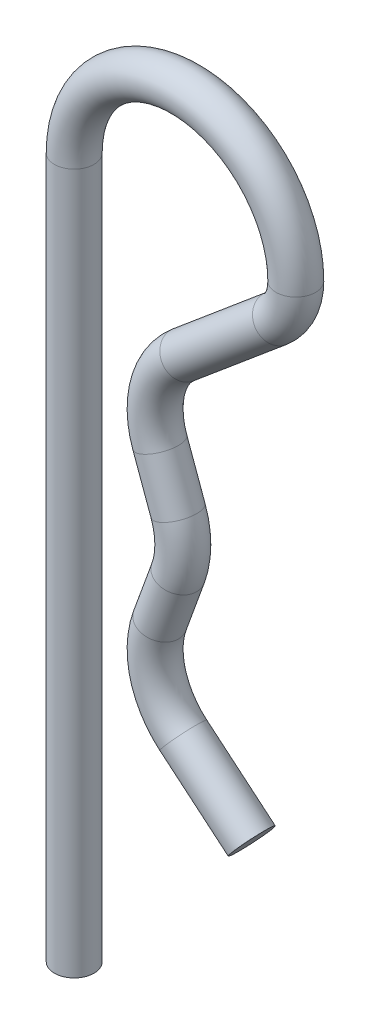
ISO-10303-21;
HEADER;
FILE_DESCRIPTION(('STEP AP214'),'2;1');
FILE_NAME('part.step','',(''),(''),'','','');
FILE_SCHEMA(('AUTOMOTIVE_DESIGN { 1 0 10303 214 1 1 1 1 }'));
ENDSEC;
DATA;
#1=APPLICATION_CONTEXT('core data for automotive mechanical design processes');
#2=APPLICATION_PROTOCOL_DEFINITION('international standard','automotive_design',2000,#1);
#3=PRODUCT_CONTEXT('',#1,'mechanical');
#4=PRODUCT('Part','Part','',(#3));
#5=PRODUCT_RELATED_PRODUCT_CATEGORY('part','',(#4));
#6=PRODUCT_DEFINITION_FORMATION('','',#4);
#7=PRODUCT_DEFINITION_CONTEXT('part definition',#1,'design');
#8=PRODUCT_DEFINITION('design','',#6,#7);
#9=PRODUCT_DEFINITION_SHAPE('','',#8);
#10=(LENGTH_UNIT() NAMED_UNIT(*) SI_UNIT(.MILLI.,.METRE.));
#11=(NAMED_UNIT(*) PLANE_ANGLE_UNIT() SI_UNIT($,.RADIAN.));
#12=(NAMED_UNIT(*) SI_UNIT($,.STERADIAN.) SOLID_ANGLE_UNIT());
#13=UNCERTAINTY_MEASURE_WITH_UNIT(LENGTH_MEASURE(1.E-05),#10,'distance_accuracy_value','');
#14=(GEOMETRIC_REPRESENTATION_CONTEXT(3) GLOBAL_UNCERTAINTY_ASSIGNED_CONTEXT((#13)) GLOBAL_UNIT_ASSIGNED_CONTEXT((#10,
#11,#12)) REPRESENTATION_CONTEXT('',''));
#15=CARTESIAN_POINT('',(0.,0.,0.));
#16=DIRECTION('',(0.,0.,1.));
#17=DIRECTION('',(1.,0.,0.));
#18=AXIS2_PLACEMENT_3D('',#15,#16,#17);
#19=CARTESIAN_POINT('',(22.4284719548847,-28.060779265165,0.));
#20=DIRECTION('',(-0.766044443118976,0.642787609686541,0.));
#21=DIRECTION('',(0.,0.,-1.));
#22=AXIS2_PLACEMENT_3D('',#19,#20,#21);
#23=PLANE('',#22);
#24=CARTESIAN_POINT('',(22.4284719548847,-28.060779265165,0.));
#25=DIRECTION('',(0.766044443118976,-0.642787609686541,0.));
#26=DIRECTION('',(0.,0.,-1.));
#27=AXIS2_PLACEMENT_3D('',#24,#25,#26);
#28=CIRCLE('',#27,2.5);
#29=CARTESIAN_POINT('',(22.4284719548847,-28.060779265165,-2.5));
#30=VERTEX_POINT('',#29);
#31=EDGE_CURVE('E48',#30,#30,#28,.T.);
#32=ORIENTED_EDGE('',*,*,#31,.T.);
#33=EDGE_LOOP('',(#32));
#34=FACE_BOUND('',#33,.T.);
#35=ADVANCED_FACE('F36',(#34),#23,.F.);
#36=CARTESIAN_POINT('',(0.,-52.5,0.));
#37=DIRECTION('',(0.,-1.,0.));
#38=DIRECTION('',(0.,0.,-1.));
#39=AXIS2_PLACEMENT_3D('',#36,#37,#38);
#40=PLANE('',#39);
#41=CARTESIAN_POINT('',(0.,-52.5,0.));
#42=DIRECTION('',(0.,1.,0.));
#43=DIRECTION('',(0.,0.,-1.));
#44=AXIS2_PLACEMENT_3D('',#41,#42,#43);
#45=CIRCLE('',#44,2.5);
#46=CARTESIAN_POINT('',(0.,-52.5,-2.5));
#47=VERTEX_POINT('',#46);
#48=EDGE_CURVE('E11',#47,#47,#45,.T.);
#49=ORIENTED_EDGE('',*,*,#48,.F.);
#50=EDGE_LOOP('',(#49));
#51=FACE_BOUND('',#50,.T.);
#52=ADVANCED_FACE('F54',(#51),#40,.T.);
#53=CARTESIAN_POINT('',(22.4284719548847,-28.060779265165,0.));
#54=DIRECTION('',(-0.766044443118976,0.642787609686541,0.));
#55=DIRECTION('',(-0.642787609686541,-0.766044443118977,0.));
#56=AXIS2_PLACEMENT_3D('',#53,#54,#55);
#57=CYLINDRICAL_SURFACE('',#56,2.5);
#58=CARTESIAN_POINT('',(13.7926345887832,-20.8144513163621,0.));
#59=DIRECTION('',(0.766044443118976,-0.642787609686541,0.));
#60=DIRECTION('',(0.,0.,-1.));
#61=AXIS2_PLACEMENT_3D('',#58,#59,#60);
#62=CIRCLE('',#61,2.5);
#63=CARTESIAN_POINT('',(12.1856655645668,-22.7295624241595,0.));
#64=VERTEX_POINT('',#63);
#65=EDGE_CURVE('E108',#64,#64,#62,.T.);
#66=ORIENTED_EDGE('',*,*,#65,.T.);
#67=EDGE_LOOP('',(#66));
#68=FACE_BOUND('',#67,.T.);
#69=ORIENTED_EDGE('',*,*,#31,.F.);
#70=EDGE_LOOP('',(#69));
#71=FACE_BOUND('',#70,.T.);
#72=ADVANCED_FACE('F56',(#68,#71),#57,.T.);
#73=CARTESIAN_POINT('',(20.2205106856486,-13.1540068851723,0.));
#74=DIRECTION('',(0.,0.,-1.));
#75=DIRECTION('',(-1.,0.,0.));
#76=AXIS2_PLACEMENT_3D('',#73,#74,#75);
#77=TOROIDAL_SURFACE('',#76,10.,2.5);
#78=CARTESIAN_POINT('',(10.8235844777895,-9.73380545191562,0.));
#79=DIRECTION('',(-0.342020143325666,-0.939692620785909,0.));
#80=DIRECTION('',(0.,0.,-1.));
#81=AXIS2_PLACEMENT_3D('',#78,#79,#80);
#82=CIRCLE('',#81,2.5);
#83=CARTESIAN_POINT('',(8.4743529258247,-8.87875509360146,0.));
#84=VERTEX_POINT('',#83);
#85=EDGE_CURVE('E105',#84,#84,#82,.T.);
#86=CARTESIAN_POINT('',(20.2205106856486,-13.1540068851723,0.));
#87=DIRECTION('',(0.,0.,-1.));
#88=DIRECTION('',(-1.,0.,0.));
#89=AXIS2_PLACEMENT_3D('',#86,#87,#88);
#90=CIRCLE('',#89,12.5);
#91=EDGE_CURVE('',#64,#84,#90,.T.);
#92=ORIENTED_EDGE('',*,*,#65,.F.);
#93=ORIENTED_EDGE('',*,*,#85,.T.);
#94=ORIENTED_EDGE('',*,*,#91,.T.);
#95=ORIENTED_EDGE('',*,*,#91,.F.);
#96=EDGE_LOOP('',(#92,#94,#93,#95));
#97=FACE_BOUND('',#96,.T.);
#98=ADVANCED_FACE('F61',(#97),#77,.T.);
#99=CARTESIAN_POINT('',(10.8235844777895,-9.73380545191562,0.));
#100=DIRECTION('',(0.342020143325666,0.939692620785909,0.));
#101=DIRECTION('',(-0.939692620785909,0.342020143325666,0.));
#102=AXIS2_PLACEMENT_3D('',#99,#100,#101);
#103=CYLINDRICAL_SURFACE('',#102,2.5);
#104=CARTESIAN_POINT('',(13.1215484115248,-3.42020143325666,0.));
#105=DIRECTION('',(-0.342020143325666,-0.939692620785909,0.));
#106=DIRECTION('',(0.,0.,-1.));
#107=AXIS2_PLACEMENT_3D('',#104,#105,#106);
#108=CIRCLE('',#107,2.5);
#109=CARTESIAN_POINT('',(15.4707799634896,-4.27525179157083,0.));
#110=VERTEX_POINT('',#109);
#111=EDGE_CURVE('E110',#110,#110,#108,.T.);
#112=ORIENTED_EDGE('',*,*,#111,.T.);
#113=EDGE_LOOP('',(#112));
#114=FACE_BOUND('',#113,.T.);
#115=ORIENTED_EDGE('',*,*,#85,.F.);
#116=EDGE_LOOP('',(#115));
#117=FACE_BOUND('',#116,.T.);
#118=ADVANCED_FACE('F93',(#114,#117),#103,.T.);
#119=CARTESIAN_POINT('',(3.7246222036657,0.,0.));
#120=DIRECTION('',(0.,0.,1.));
#121=DIRECTION('',(1.,0.,0.));
#122=AXIS2_PLACEMENT_3D('',#119,#120,#121);
#123=TOROIDAL_SURFACE('',#122,10.,2.5);
#124=CARTESIAN_POINT('',(13.1215484115248,3.42020143325667,0.));
#125=DIRECTION('',(0.342020143325668,-0.939692620785909,0.));
#126=DIRECTION('',(0.,0.,-1.));
#127=AXIS2_PLACEMENT_3D('',#124,#125,#126);
#128=CIRCLE('',#127,2.5);
#129=CARTESIAN_POINT('',(15.4707799634896,4.27525179157084,0.));
#130=VERTEX_POINT('',#129);
#131=EDGE_CURVE('E116',#130,#130,#128,.T.);
#132=CARTESIAN_POINT('',(3.7246222036657,0.,0.));
#133=DIRECTION('',(0.,0.,1.));
#134=DIRECTION('',(1.,0.,0.));
#135=AXIS2_PLACEMENT_3D('',#132,#133,#134);
#136=CIRCLE('',#135,12.5);
#137=EDGE_CURVE('',#110,#130,#136,.T.);
#138=ORIENTED_EDGE('',*,*,#111,.F.);
#139=ORIENTED_EDGE('',*,*,#131,.T.);
#140=ORIENTED_EDGE('',*,*,#137,.T.);
#141=ORIENTED_EDGE('',*,*,#137,.F.);
#142=EDGE_LOOP('',(#138,#140,#139,#141));
#143=FACE_BOUND('',#142,.T.);
#144=ADVANCED_FACE('F89',(#143),#123,.T.);
#145=CARTESIAN_POINT('',(13.1215484115248,3.42020143325668,0.));
#146=DIRECTION('',(-0.34202014332567,0.939692620785908,0.));
#147=DIRECTION('',(-0.939692620785908,-0.34202014332567,0.));
#148=AXIS2_PLACEMENT_3D('',#145,#146,#147);
#149=CYLINDRICAL_SURFACE('',#148,2.5);
#150=CARTESIAN_POINT('',(10.8235844777894,9.73380545191564,0.));
#151=DIRECTION('',(0.34202014332567,-0.939692620785908,0.));
#152=DIRECTION('',(0.,0.,-1.));
#153=AXIS2_PLACEMENT_3D('',#150,#151,#152);
#154=CIRCLE('',#153,2.5);
#155=CARTESIAN_POINT('',(8.47435292582467,8.87875509360147,0.));
#156=VERTEX_POINT('',#155);
#157=EDGE_CURVE('E119',#156,#156,#154,.T.);
#158=ORIENTED_EDGE('',*,*,#157,.T.);
#159=EDGE_LOOP('',(#158));
#160=FACE_BOUND('',#159,.T.);
#161=ORIENTED_EDGE('',*,*,#131,.F.);
#162=EDGE_LOOP('',(#161));
#163=FACE_BOUND('',#162,.T.);
#164=ADVANCED_FACE('F85',(#160,#163),#149,.T.);
#165=CARTESIAN_POINT('',(20.2205106856486,13.1540068851723,0.));
#166=DIRECTION('',(0.,0.,-1.));
#167=DIRECTION('',(-1.,0.,0.));
#168=AXIS2_PLACEMENT_3D('',#165,#166,#167);
#169=TOROIDAL_SURFACE('',#168,10.,2.5);
#170=CARTESIAN_POINT('',(13.7926345887832,20.8144513163621,0.));
#171=DIRECTION('',(-0.766044443118978,-0.642787609686539,0.));
#172=DIRECTION('',(0.,0.,-1.));
#173=AXIS2_PLACEMENT_3D('',#170,#171,#172);
#174=CIRCLE('',#173,2.5);
#175=CARTESIAN_POINT('',(12.1856655645668,22.7295624241595,0.));
#176=VERTEX_POINT('',#175);
#177=EDGE_CURVE('E122',#176,#176,#174,.T.);
#178=CARTESIAN_POINT('',(20.2205106856486,13.1540068851723,0.));
#179=DIRECTION('',(0.,0.,-1.));
#180=DIRECTION('',(-1.,0.,0.));
#181=AXIS2_PLACEMENT_3D('',#178,#179,#180);
#182=CIRCLE('',#181,12.5);
#183=EDGE_CURVE('',#156,#176,#182,.T.);
#184=ORIENTED_EDGE('',*,*,#157,.F.);
#185=ORIENTED_EDGE('',*,*,#177,.T.);
#186=ORIENTED_EDGE('',*,*,#183,.T.);
#187=ORIENTED_EDGE('',*,*,#183,.F.);
#188=EDGE_LOOP('',(#184,#186,#185,#187));
#189=FACE_BOUND('',#188,.T.);
#190=ADVANCED_FACE('F81',(#189),#169,.T.);
#191=CARTESIAN_POINT('',(13.7926345887832,20.8144513163621,0.));
#192=DIRECTION('',(0.766044443118978,0.64278760968654,0.));
#193=DIRECTION('',(-0.64278760968654,0.766044443118978,0.));
#194=AXIS2_PLACEMENT_3D('',#191,#192,#193);
#195=CYLINDRICAL_SURFACE('',#194,2.5);
#196=CARTESIAN_POINT('',(25.4995132678058,30.6376888981672,0.));
#197=DIRECTION('',(-0.766044443118978,-0.64278760968654,0.));
#198=DIRECTION('',(0.,0.,-1.));
#199=AXIS2_PLACEMENT_3D('',#196,#197,#198);
#200=CIRCLE('',#199,2.5);
#201=CARTESIAN_POINT('',(27.1064822920221,28.7225777903697,0.));
#202=VERTEX_POINT('',#201);
#203=EDGE_CURVE('E125',#202,#202,#200,.T.);
#204=ORIENTED_EDGE('',*,*,#203,.T.);
#205=EDGE_LOOP('',(#204));
#206=FACE_BOUND('',#205,.T.);
#207=ORIENTED_EDGE('',*,*,#177,.F.);
#208=EDGE_LOOP('',(#207));
#209=FACE_BOUND('',#208,.T.);
#210=ADVANCED_FACE('F77',(#206,#209),#195,.T.);
#211=CARTESIAN_POINT('',(21.,36.,0.));
#212=DIRECTION('',(0.,0.,1.));
#213=DIRECTION('',(1.,0.,0.));
#214=AXIS2_PLACEMENT_3D('',#211,#212,#213);
#215=TOROIDAL_SURFACE('',#214,7.00000000000001,2.5);
#216=CARTESIAN_POINT('',(28.,36.,0.));
#217=DIRECTION('',(0.,-1.,0.));
#218=DIRECTION('',(0.,0.,-1.));
#219=AXIS2_PLACEMENT_3D('',#216,#217,#218);
#220=CIRCLE('',#219,2.5);
#221=CARTESIAN_POINT('',(30.5,36.,0.));
#222=VERTEX_POINT('',#221);
#223=EDGE_CURVE('E128',#222,#222,#220,.T.);
#224=CARTESIAN_POINT('',(21.,36.,0.));
#225=DIRECTION('',(0.,0.,1.));
#226=DIRECTION('',(1.,0.,0.));
#227=AXIS2_PLACEMENT_3D('',#224,#225,#226);
#228=CIRCLE('',#227,9.50000000000001);
#229=EDGE_CURVE('',#202,#222,#228,.T.);
#230=ORIENTED_EDGE('',*,*,#203,.F.);
#231=ORIENTED_EDGE('',*,*,#223,.T.);
#232=ORIENTED_EDGE('',*,*,#229,.T.);
#233=ORIENTED_EDGE('',*,*,#229,.F.);
#234=EDGE_LOOP('',(#230,#232,#231,#233));
#235=FACE_BOUND('',#234,.T.);
#236=ADVANCED_FACE('F71',(#235),#215,.T.);
#237=CARTESIAN_POINT('',(14.,36.,0.));
#238=DIRECTION('',(0.,0.,1.));
#239=DIRECTION('',(1.,0.,0.));
#240=AXIS2_PLACEMENT_3D('',#237,#238,#239);
#241=TOROIDAL_SURFACE('',#240,14.,2.5);
#242=CARTESIAN_POINT('',(0.,36.,0.));
#243=DIRECTION('',(0.,1.,0.));
#244=DIRECTION('',(0.,0.,-1.));
#245=AXIS2_PLACEMENT_3D('',#242,#243,#244);
#246=CIRCLE('',#245,2.5);
#247=CARTESIAN_POINT('',(-2.5,36.,0.));
#248=VERTEX_POINT('',#247);
#249=EDGE_CURVE('E43',#248,#248,#246,.T.);
#250=CARTESIAN_POINT('',(14.,36.,0.));
#251=DIRECTION('',(0.,0.,1.));
#252=DIRECTION('',(1.,0.,0.));
#253=AXIS2_PLACEMENT_3D('',#250,#251,#252);
#254=CIRCLE('',#253,16.5);
#255=EDGE_CURVE('',#222,#248,#254,.T.);
#256=ORIENTED_EDGE('',*,*,#223,.F.);
#257=ORIENTED_EDGE('',*,*,#249,.T.);
#258=ORIENTED_EDGE('',*,*,#255,.T.);
#259=ORIENTED_EDGE('',*,*,#255,.F.);
#260=EDGE_LOOP('',(#256,#258,#257,#259));
#261=FACE_BOUND('',#260,.T.);
#262=ADVANCED_FACE('F67',(#261),#241,.T.);
#263=CARTESIAN_POINT('',(0.,36.,0.));
#264=DIRECTION('',(0.,-1.,0.));
#265=DIRECTION('',(1.,0.,0.));
#266=AXIS2_PLACEMENT_3D('',#263,#264,#265);
#267=CYLINDRICAL_SURFACE('',#266,2.5);
#268=ORIENTED_EDGE('',*,*,#48,.T.);
#269=EDGE_LOOP('',(#268));
#270=FACE_BOUND('',#269,.T.);
#271=ORIENTED_EDGE('',*,*,#249,.F.);
#272=EDGE_LOOP('',(#271));
#273=FACE_BOUND('',#272,.T.);
#274=ADVANCED_FACE('F51',(#270,#273),#267,.T.);
#275=CLOSED_SHELL('',(#35,#52,#72,#98,#118,#144,#164,#190,#210,#236,#262,#274));
#276=MANIFOLD_SOLID_BREP('B2',#275);
#277=ADVANCED_BREP_SHAPE_REPRESENTATION('',(#18,#276),#14);
#278=SHAPE_DEFINITION_REPRESENTATION(#9,#277);
ENDSEC;
END-ISO-10303-21;
